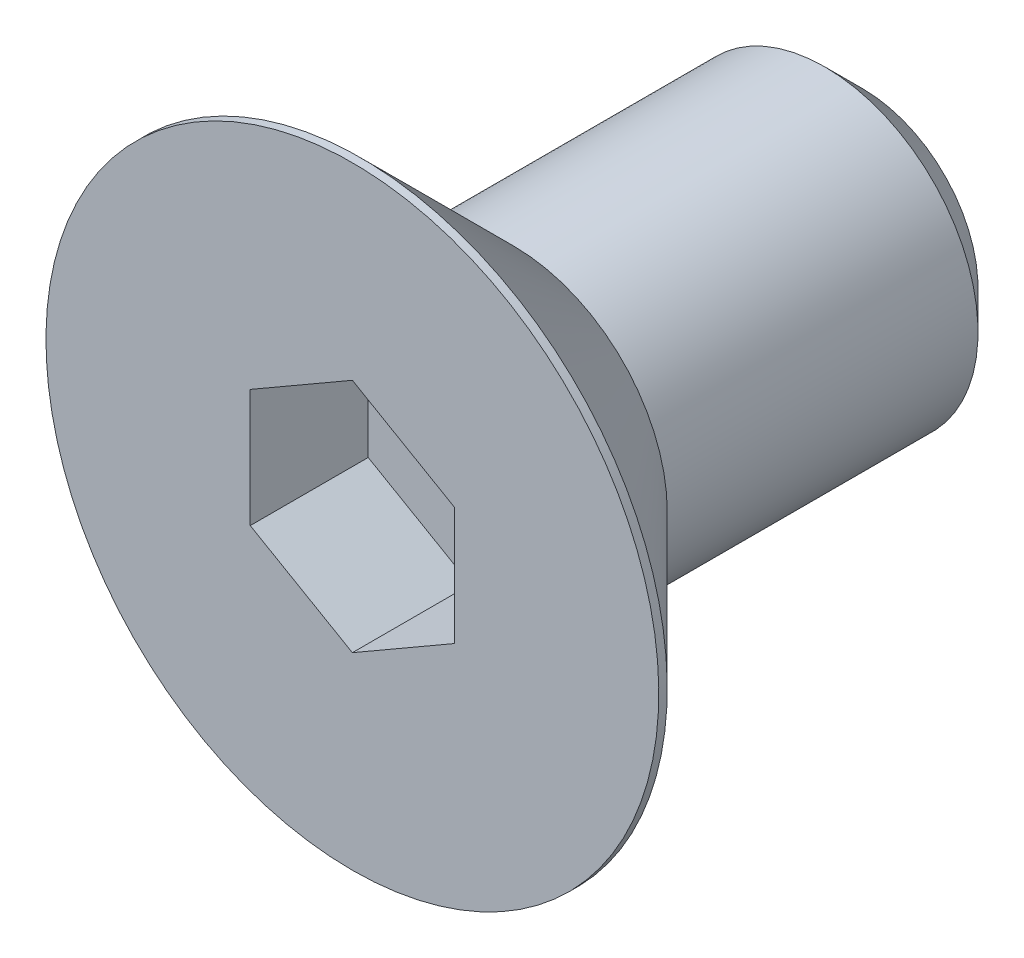
ISO-10303-21;
HEADER;
FILE_DESCRIPTION(('STEP AP214'),'2;1');
FILE_NAME('part.step','',(''),(''),'','','');
FILE_SCHEMA(('AUTOMOTIVE_DESIGN { 1 0 10303 214 1 1 1 1 }'));
ENDSEC;
DATA;
#1=APPLICATION_CONTEXT('core data for automotive mechanical design processes');
#2=APPLICATION_PROTOCOL_DEFINITION('international standard','automotive_design',2000,#1);
#3=PRODUCT_CONTEXT('',#1,'mechanical');
#4=PRODUCT('Part','Part','',(#3));
#5=PRODUCT_RELATED_PRODUCT_CATEGORY('part','',(#4));
#6=PRODUCT_DEFINITION_FORMATION('','',#4);
#7=PRODUCT_DEFINITION_CONTEXT('part definition',#1,'design');
#8=PRODUCT_DEFINITION('design','',#6,#7);
#9=PRODUCT_DEFINITION_SHAPE('','',#8);
#10=(LENGTH_UNIT() NAMED_UNIT(*) SI_UNIT(.MILLI.,.METRE.));
#11=(NAMED_UNIT(*) PLANE_ANGLE_UNIT() SI_UNIT($,.RADIAN.));
#12=(NAMED_UNIT(*) SI_UNIT($,.STERADIAN.) SOLID_ANGLE_UNIT());
#13=UNCERTAINTY_MEASURE_WITH_UNIT(LENGTH_MEASURE(1.E-05),#10,'distance_accuracy_value','');
#14=(GEOMETRIC_REPRESENTATION_CONTEXT(3) GLOBAL_UNCERTAINTY_ASSIGNED_CONTEXT((#13)) GLOBAL_UNIT_ASSIGNED_CONTEXT((#10,
#11,#12)) REPRESENTATION_CONTEXT('',''));
#15=CARTESIAN_POINT('',(0.,0.,0.));
#16=DIRECTION('',(0.,0.,1.));
#17=DIRECTION('',(1.,0.,0.));
#18=AXIS2_PLACEMENT_3D('',#15,#16,#17);
#19=CARTESIAN_POINT('',(0.,0.,4.83500000000001));
#20=DIRECTION('',(0.,0.,1.));
#21=DIRECTION('',(0.,-1.,0.));
#22=AXIS2_PLACEMENT_3D('',#19,#20,#21);
#23=CONICAL_SURFACE('',#22,6.,0.785398163397448);
#24=CARTESIAN_POINT('',(0.,0.,1.70000000000001));
#25=DIRECTION('',(0.,0.,1.));
#26=DIRECTION('',(0.,-1.,0.));
#27=AXIS2_PLACEMENT_3D('',#24,#25,#26);
#28=CIRCLE('',#27,2.865);
#29=CARTESIAN_POINT('',(0.,-2.865,1.70000000000001));
#30=VERTEX_POINT('',#29);
#31=EDGE_CURVE('E150',#30,#30,#28,.T.);
#32=ORIENTED_EDGE('',*,*,#31,.T.);
#33=EDGE_LOOP('',(#32));
#34=FACE_BOUND('',#33,.T.);
#35=CARTESIAN_POINT('',(0.,0.,4.83500000000001));
#36=DIRECTION('',(0.,0.,1.));
#37=DIRECTION('',(0.,-1.,0.));
#38=AXIS2_PLACEMENT_3D('',#35,#36,#37);
#39=CIRCLE('',#38,6.);
#40=CARTESIAN_POINT('',(0.,-6.,4.83500000000001));
#41=VERTEX_POINT('',#40);
#42=EDGE_CURVE('E12',#41,#41,#39,.T.);
#43=ORIENTED_EDGE('',*,*,#42,.F.);
#44=EDGE_LOOP('',(#43));
#45=FACE_BOUND('',#44,.T.);
#46=ADVANCED_FACE('F49',(#34,#45),#23,.T.);
#47=CARTESIAN_POINT('',(0.,0.,5.));
#48=DIRECTION('',(0.,0.,1.));
#49=DIRECTION('',(0.,-1.,0.));
#50=AXIS2_PLACEMENT_3D('',#47,#48,#49);
#51=CYLINDRICAL_SURFACE('',#50,6.);
#52=ORIENTED_EDGE('',*,*,#42,.T.);
#53=EDGE_LOOP('',(#52));
#54=FACE_BOUND('',#53,.T.);
#55=CARTESIAN_POINT('',(0.,0.,5.));
#56=DIRECTION('',(0.,0.,1.));
#57=DIRECTION('',(0.,-1.,0.));
#58=AXIS2_PLACEMENT_3D('',#55,#56,#57);
#59=CIRCLE('',#58,6.);
#60=CARTESIAN_POINT('',(0.,-6.,5.));
#61=VERTEX_POINT('',#60);
#62=EDGE_CURVE('E56',#61,#61,#59,.T.);
#63=ORIENTED_EDGE('',*,*,#62,.F.);
#64=EDGE_LOOP('',(#63));
#65=FACE_BOUND('',#64,.T.);
#66=ADVANCED_FACE('F162',(#54,#65),#51,.T.);
#67=CARTESIAN_POINT('',(0.,0.,5.));
#68=DIRECTION('',(0.,0.,-1.));
#69=DIRECTION('',(0.,1.,0.));
#70=AXIS2_PLACEMENT_3D('',#67,#68,#69);
#71=PLANE('',#70);
#72=DIRECTION('',(0.,1.,0.));
#73=VECTOR('',#72,1.);
#74=CARTESIAN_POINT('',(2.,-1.15470053837925,5.));
#75=LINE('',#74,#73);
#76=CARTESIAN_POINT('',(2.,-1.15470053837925,5.));
#77=VERTEX_POINT('',#76);
#78=CARTESIAN_POINT('',(2.,1.15470053837925,5.));
#79=VERTEX_POINT('',#78);
#80=EDGE_CURVE('E137',#77,#79,#75,.T.);
#81=ORIENTED_EDGE('',*,*,#80,.F.);
#82=DIRECTION('',(0.866025403784438,0.500000000000001,0.));
#83=VECTOR('',#82,1.);
#84=CARTESIAN_POINT('',(0.,-2.3094010767585,5.));
#85=LINE('',#84,#83);
#86=CARTESIAN_POINT('',(0.,-2.3094010767585,5.));
#87=VERTEX_POINT('',#86);
#88=EDGE_CURVE('E63',#87,#77,#85,.T.);
#89=ORIENTED_EDGE('',*,*,#88,.F.);
#90=DIRECTION('',(0.866025403784438,-0.5,0.));
#91=VECTOR('',#90,1.);
#92=CARTESIAN_POINT('',(-1.99999999999999,-1.15470053837925,5.));
#93=LINE('',#92,#91);
#94=CARTESIAN_POINT('',(-1.99999999999999,-1.15470053837925,5.));
#95=VERTEX_POINT('',#94);
#96=EDGE_CURVE('E146',#95,#87,#93,.T.);
#97=ORIENTED_EDGE('',*,*,#96,.F.);
#98=DIRECTION('',(0.,-1.,0.));
#99=VECTOR('',#98,1.);
#100=CARTESIAN_POINT('',(-1.99999999999999,1.15470053837925,5.));
#101=LINE('',#100,#99);
#102=CARTESIAN_POINT('',(-1.99999999999999,1.15470053837925,5.));
#103=VERTEX_POINT('',#102);
#104=EDGE_CURVE('E144',#103,#95,#101,.T.);
#105=ORIENTED_EDGE('',*,*,#104,.F.);
#106=DIRECTION('',(-0.866025403784439,-0.5,0.));
#107=VECTOR('',#106,1.);
#108=CARTESIAN_POINT('',(0.,2.3094010767585,5.));
#109=LINE('',#108,#107);
#110=CARTESIAN_POINT('',(0.,2.3094010767585,5.));
#111=VERTEX_POINT('',#110);
#112=EDGE_CURVE('E111',#111,#103,#109,.T.);
#113=ORIENTED_EDGE('',*,*,#112,.F.);
#114=DIRECTION('',(-0.866025403784439,0.5,0.));
#115=VECTOR('',#114,1.);
#116=CARTESIAN_POINT('',(2.,1.15470053837925,5.));
#117=LINE('',#116,#115);
#118=EDGE_CURVE('E140',#79,#111,#117,.T.);
#119=ORIENTED_EDGE('',*,*,#118,.F.);
#120=EDGE_LOOP('',(#81,#89,#97,#105,#113,#119));
#121=FACE_BOUND('',#120,.T.);
#122=ORIENTED_EDGE('',*,*,#62,.T.);
#123=EDGE_LOOP('',(#122));
#124=FACE_BOUND('',#123,.T.);
#125=ADVANCED_FACE('F160',(#121,#124),#71,.F.);
#126=CARTESIAN_POINT('',(0.,0.,1.70000000000001));
#127=DIRECTION('',(0.,0.,-1.));
#128=DIRECTION('',(0.,1.,0.));
#129=AXIS2_PLACEMENT_3D('',#126,#127,#128);
#130=PLANE('',#129);
#131=ORIENTED_EDGE('',*,*,#31,.F.);
#132=EDGE_LOOP('',(#131));
#133=FACE_BOUND('',#132,.T.);
#134=ADVANCED_FACE('F169',(#133),#130,.T.);
#135=CARTESIAN_POINT('',(0.,-2.3094010767585,2.69));
#136=DIRECTION('',(0.500000000000001,-0.866025403784438,0.));
#137=DIRECTION('',(0.866025403784438,0.500000000000001,0.));
#138=AXIS2_PLACEMENT_3D('',#135,#136,#137);
#139=PLANE('',#138);
#140=ORIENTED_EDGE('',*,*,#88,.T.);
#141=DIRECTION('',(0.,0.,1.));
#142=VECTOR('',#141,1.);
#143=CARTESIAN_POINT('',(2.,-1.15470053837925,2.69));
#144=LINE('',#143,#142);
#145=CARTESIAN_POINT('',(2.,-1.15470053837925,2.69));
#146=VERTEX_POINT('',#145);
#147=EDGE_CURVE('E93',#146,#77,#144,.T.);
#148=ORIENTED_EDGE('',*,*,#147,.F.);
#149=DIRECTION('',(0.866025403784438,0.500000000000001,0.));
#150=VECTOR('',#149,1.);
#151=CARTESIAN_POINT('',(0.,-2.3094010767585,2.69));
#152=LINE('',#151,#150);
#153=CARTESIAN_POINT('',(0.,-2.3094010767585,2.69));
#154=VERTEX_POINT('',#153);
#155=EDGE_CURVE('E148',#154,#146,#152,.T.);
#156=ORIENTED_EDGE('',*,*,#155,.F.);
#157=DIRECTION('',(0.,0.,1.));
#158=VECTOR('',#157,1.);
#159=CARTESIAN_POINT('',(0.,-2.3094010767585,2.69));
#160=LINE('',#159,#158);
#161=EDGE_CURVE('E71',#154,#87,#160,.T.);
#162=ORIENTED_EDGE('',*,*,#161,.T.);
#163=EDGE_LOOP('',(#140,#148,#156,#162));
#164=FACE_BOUND('',#163,.T.);
#165=ADVANCED_FACE('F176',(#164),#139,.F.);
#166=CARTESIAN_POINT('',(-1.99999999999999,-1.15470053837925,2.69));
#167=DIRECTION('',(-0.5,-0.866025403784439,0.));
#168=DIRECTION('',(0.866025403784439,-0.5,0.));
#169=AXIS2_PLACEMENT_3D('',#166,#167,#168);
#170=PLANE('',#169);
#171=ORIENTED_EDGE('',*,*,#96,.T.);
#172=ORIENTED_EDGE('',*,*,#161,.F.);
#173=DIRECTION('',(0.866025403784438,-0.5,0.));
#174=VECTOR('',#173,1.);
#175=CARTESIAN_POINT('',(-1.99999999999999,-1.15470053837925,2.69));
#176=LINE('',#175,#174);
#177=CARTESIAN_POINT('',(-1.99999999999999,-1.15470053837925,2.69));
#178=VERTEX_POINT('',#177);
#179=EDGE_CURVE('E123',#178,#154,#176,.T.);
#180=ORIENTED_EDGE('',*,*,#179,.F.);
#181=DIRECTION('',(0.,0.,1.));
#182=VECTOR('',#181,1.);
#183=CARTESIAN_POINT('',(-1.99999999999999,-1.15470053837925,2.69));
#184=LINE('',#183,#182);
#185=EDGE_CURVE('E115',#178,#95,#184,.T.);
#186=ORIENTED_EDGE('',*,*,#185,.T.);
#187=EDGE_LOOP('',(#171,#172,#180,#186));
#188=FACE_BOUND('',#187,.T.);
#189=ADVANCED_FACE('F180',(#188),#170,.F.);
#190=CARTESIAN_POINT('',(-1.99999999999999,1.15470053837925,2.69));
#191=DIRECTION('',(-1.,0.,0.));
#192=DIRECTION('',(0.,-1.,0.));
#193=AXIS2_PLACEMENT_3D('',#190,#191,#192);
#194=PLANE('',#193);
#195=ORIENTED_EDGE('',*,*,#104,.T.);
#196=ORIENTED_EDGE('',*,*,#185,.F.);
#197=DIRECTION('',(0.,-1.,0.));
#198=VECTOR('',#197,1.);
#199=CARTESIAN_POINT('',(-1.99999999999999,1.15470053837925,2.69));
#200=LINE('',#199,#198);
#201=CARTESIAN_POINT('',(-1.99999999999999,1.15470053837925,2.69));
#202=VERTEX_POINT('',#201);
#203=EDGE_CURVE('E119',#202,#178,#200,.T.);
#204=ORIENTED_EDGE('',*,*,#203,.F.);
#205=DIRECTION('',(0.,0.,1.));
#206=VECTOR('',#205,1.);
#207=CARTESIAN_POINT('',(-1.99999999999999,1.15470053837925,2.69));
#208=LINE('',#207,#206);
#209=EDGE_CURVE('E104',#202,#103,#208,.T.);
#210=ORIENTED_EDGE('',*,*,#209,.T.);
#211=EDGE_LOOP('',(#195,#196,#204,#210));
#212=FACE_BOUND('',#211,.T.);
#213=ADVANCED_FACE('F120',(#212),#194,.F.);
#214=CARTESIAN_POINT('',(0.,2.3094010767585,2.69));
#215=DIRECTION('',(-0.5,0.866025403784439,0.));
#216=DIRECTION('',(-0.866025403784439,-0.5,0.));
#217=AXIS2_PLACEMENT_3D('',#214,#215,#216);
#218=PLANE('',#217);
#219=ORIENTED_EDGE('',*,*,#112,.T.);
#220=ORIENTED_EDGE('',*,*,#209,.F.);
#221=DIRECTION('',(-0.866025403784439,-0.5,0.));
#222=VECTOR('',#221,1.);
#223=CARTESIAN_POINT('',(0.,2.3094010767585,2.69));
#224=LINE('',#223,#222);
#225=CARTESIAN_POINT('',(0.,2.3094010767585,2.69));
#226=VERTEX_POINT('',#225);
#227=EDGE_CURVE('E108',#226,#202,#224,.T.);
#228=ORIENTED_EDGE('',*,*,#227,.F.);
#229=DIRECTION('',(0.,0.,1.));
#230=VECTOR('',#229,1.);
#231=CARTESIAN_POINT('',(0.,2.3094010767585,2.69));
#232=LINE('',#231,#230);
#233=EDGE_CURVE('E116',#226,#111,#232,.T.);
#234=ORIENTED_EDGE('',*,*,#233,.T.);
#235=EDGE_LOOP('',(#219,#220,#228,#234));
#236=FACE_BOUND('',#235,.T.);
#237=ADVANCED_FACE('F106',(#236),#218,.F.);
#238=CARTESIAN_POINT('',(2.,1.15470053837925,2.69));
#239=DIRECTION('',(0.5,0.866025403784439,0.));
#240=DIRECTION('',(-0.866025403784439,0.5,0.));
#241=AXIS2_PLACEMENT_3D('',#238,#239,#240);
#242=PLANE('',#241);
#243=ORIENTED_EDGE('',*,*,#118,.T.);
#244=ORIENTED_EDGE('',*,*,#233,.F.);
#245=DIRECTION('',(-0.866025403784439,0.5,0.));
#246=VECTOR('',#245,1.);
#247=CARTESIAN_POINT('',(2.,1.15470053837925,2.69));
#248=LINE('',#247,#246);
#249=CARTESIAN_POINT('',(2.,1.15470053837925,2.69));
#250=VERTEX_POINT('',#249);
#251=EDGE_CURVE('E129',#250,#226,#248,.T.);
#252=ORIENTED_EDGE('',*,*,#251,.F.);
#253=DIRECTION('',(0.,0.,1.));
#254=VECTOR('',#253,1.);
#255=CARTESIAN_POINT('',(2.,1.15470053837925,2.69));
#256=LINE('',#255,#254);
#257=EDGE_CURVE('E153',#250,#79,#256,.T.);
#258=ORIENTED_EDGE('',*,*,#257,.T.);
#259=EDGE_LOOP('',(#243,#244,#252,#258));
#260=FACE_BOUND('',#259,.T.);
#261=ADVANCED_FACE('F184',(#260),#242,.F.);
#262=CARTESIAN_POINT('',(2.,-1.15470053837925,2.69));
#263=DIRECTION('',(1.,0.,0.));
#264=DIRECTION('',(0.,0.,-1.));
#265=AXIS2_PLACEMENT_3D('',#262,#263,#264);
#266=PLANE('',#265);
#267=ORIENTED_EDGE('',*,*,#80,.T.);
#268=ORIENTED_EDGE('',*,*,#257,.F.);
#269=DIRECTION('',(0.,1.,0.));
#270=VECTOR('',#269,1.);
#271=CARTESIAN_POINT('',(2.,-1.15470053837925,2.69));
#272=LINE('',#271,#270);
#273=EDGE_CURVE('E131',#146,#250,#272,.T.);
#274=ORIENTED_EDGE('',*,*,#273,.F.);
#275=ORIENTED_EDGE('',*,*,#147,.T.);
#276=EDGE_LOOP('',(#267,#268,#274,#275));
#277=FACE_BOUND('',#276,.T.);
#278=ADVANCED_FACE('F181',(#277),#266,.F.);
#279=CARTESIAN_POINT('',(2.,-1.15470053837924,2.69));
#280=DIRECTION('',(0.,0.,1.));
#281=DIRECTION('',(1.,0.,0.));
#282=AXIS2_PLACEMENT_3D('',#279,#280,#281);
#283=PLANE('',#282);
#284=ORIENTED_EDGE('',*,*,#155,.T.);
#285=ORIENTED_EDGE('',*,*,#273,.T.);
#286=ORIENTED_EDGE('',*,*,#251,.T.);
#287=ORIENTED_EDGE('',*,*,#227,.T.);
#288=ORIENTED_EDGE('',*,*,#203,.T.);
#289=ORIENTED_EDGE('',*,*,#179,.T.);
#290=EDGE_LOOP('',(#284,#285,#286,#287,#288,#289));
#291=FACE_BOUND('',#290,.T.);
#292=ADVANCED_FACE('F126',(#291),#283,.T.);
#293=CLOSED_SHELL('',(#46,#66,#125,#134,#165,#189,#213,#237,#261,#278,#292));
#294=MANIFOLD_SOLID_BREP('B2',#293);
#295=CARTESIAN_POINT('',(0.,0.,2.69));
#296=DIRECTION('',(0.,0.,1.));
#297=DIRECTION('',(0.,-1.,0.));
#298=AXIS2_PLACEMENT_3D('',#295,#296,#297);
#299=CYLINDRICAL_SURFACE('',#298,3.00000000000001);
#300=CARTESIAN_POINT('',(0.,0.,-4.25));
#301=DIRECTION('',(0.,0.,1.));
#302=DIRECTION('',(0.,-1.,0.));
#303=AXIS2_PLACEMENT_3D('',#300,#301,#302);
#304=CIRCLE('',#303,3.00000000000001);
#305=CARTESIAN_POINT('',(0.,-3.00000000000001,-4.25));
#306=VERTEX_POINT('',#305);
#307=EDGE_CURVE('E278',#306,#306,#304,.T.);
#308=ORIENTED_EDGE('',*,*,#307,.T.);
#309=EDGE_LOOP('',(#308));
#310=FACE_BOUND('',#309,.T.);
#311=CARTESIAN_POINT('',(0.,0.,2.69));
#312=DIRECTION('',(0.,0.,1.));
#313=DIRECTION('',(0.,-1.,0.));
#314=AXIS2_PLACEMENT_3D('',#311,#312,#313);
#315=CIRCLE('',#314,3.00000000000001);
#316=CARTESIAN_POINT('',(0.,-3.00000000000001,2.69));
#317=VERTEX_POINT('',#316);
#318=EDGE_CURVE('E283',#317,#317,#315,.T.);
#319=ORIENTED_EDGE('',*,*,#318,.F.);
#320=EDGE_LOOP('',(#319));
#321=FACE_BOUND('',#320,.T.);
#322=ADVANCED_FACE('F270',(#310,#321),#299,.T.);
#323=CARTESIAN_POINT('',(0.,-3.,-5.00000000000001));
#324=DIRECTION('',(0.,0.,1.));
#325=DIRECTION('',(0.,-1.,0.));
#326=AXIS2_PLACEMENT_3D('',#323,#324,#325);
#327=PLANE('',#326);
#328=CARTESIAN_POINT('',(0.,0.,-5.00000000000001));
#329=DIRECTION('',(0.,0.,1.));
#330=DIRECTION('',(0.,-1.,0.));
#331=AXIS2_PLACEMENT_3D('',#328,#329,#330);
#332=CIRCLE('',#331,2.25);
#333=CARTESIAN_POINT('',(0.,-2.25,-5.00000000000001));
#334=VERTEX_POINT('',#333);
#335=EDGE_CURVE('E48',#334,#334,#332,.F.);
#336=ORIENTED_EDGE('',*,*,#335,.T.);
#337=EDGE_LOOP('',(#336));
#338=FACE_BOUND('',#337,.T.);
#339=ADVANCED_FACE('F294',(#338),#327,.F.);
#340=CARTESIAN_POINT('',(0.,-3.00000000000001,2.69));
#341=DIRECTION('',(0.,0.,-1.));
#342=DIRECTION('',(0.,1.,0.));
#343=AXIS2_PLACEMENT_3D('',#340,#341,#342);
#344=PLANE('',#343);
#345=ORIENTED_EDGE('',*,*,#318,.T.);
#346=EDGE_LOOP('',(#345));
#347=FACE_BOUND('',#346,.T.);
#348=ADVANCED_FACE('F291',(#347),#344,.F.);
#349=CARTESIAN_POINT('',(0.,0.,-4.25));
#350=DIRECTION('',(0.,0.,1.));
#351=DIRECTION('',(0.,-1.,0.));
#352=AXIS2_PLACEMENT_3D('',#349,#350,#351);
#353=CONICAL_SURFACE('',#352,3.00000000000001,0.78539816339745);
#354=ORIENTED_EDGE('',*,*,#335,.F.);
#355=EDGE_LOOP('',(#354));
#356=FACE_BOUND('',#355,.T.);
#357=ORIENTED_EDGE('',*,*,#307,.F.);
#358=EDGE_LOOP('',(#357));
#359=FACE_BOUND('',#358,.T.);
#360=ADVANCED_FACE('F272',(#356,#359),#353,.T.);
#361=CLOSED_SHELL('',(#322,#339,#348,#360));
#362=MANIFOLD_SOLID_BREP('B6',#361);
#363=ADVANCED_BREP_SHAPE_REPRESENTATION('',(#18,#294,#362),#14);
#364=SHAPE_DEFINITION_REPRESENTATION(#9,#363);
ENDSEC;
END-ISO-10303-21;
